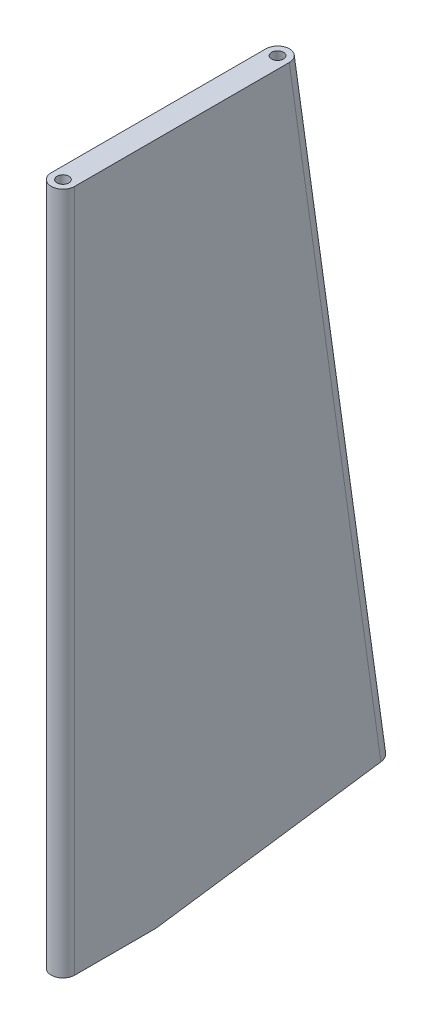
ISO-10303-21;
HEADER;
FILE_DESCRIPTION(('STEP AP214'),'2;1');
FILE_NAME('part.step','',(''),(''),'','','');
FILE_SCHEMA(('AUTOMOTIVE_DESIGN { 1 0 10303 214 1 1 1 1 }'));
ENDSEC;
DATA;
#1=APPLICATION_CONTEXT('core data for automotive mechanical design processes');
#2=APPLICATION_PROTOCOL_DEFINITION('international standard','automotive_design',2000,#1);
#3=PRODUCT_CONTEXT('',#1,'mechanical');
#4=PRODUCT('Part','Part','',(#3));
#5=PRODUCT_RELATED_PRODUCT_CATEGORY('part','',(#4));
#6=PRODUCT_DEFINITION_FORMATION('','',#4);
#7=PRODUCT_DEFINITION_CONTEXT('part definition',#1,'design');
#8=PRODUCT_DEFINITION('design','',#6,#7);
#9=PRODUCT_DEFINITION_SHAPE('','',#8);
#10=(LENGTH_UNIT() NAMED_UNIT(*) SI_UNIT(.MILLI.,.METRE.));
#11=(NAMED_UNIT(*) PLANE_ANGLE_UNIT() SI_UNIT($,.RADIAN.));
#12=(NAMED_UNIT(*) SI_UNIT($,.STERADIAN.) SOLID_ANGLE_UNIT());
#13=UNCERTAINTY_MEASURE_WITH_UNIT(LENGTH_MEASURE(1.E-05),#10,'distance_accuracy_value','');
#14=(GEOMETRIC_REPRESENTATION_CONTEXT(3) GLOBAL_UNCERTAINTY_ASSIGNED_CONTEXT((#13)) GLOBAL_UNIT_ASSIGNED_CONTEXT((#10,
#11,#12)) REPRESENTATION_CONTEXT('',''));
#15=CARTESIAN_POINT('',(0.,0.,0.));
#16=DIRECTION('',(0.,0.,1.));
#17=DIRECTION('',(1.,0.,0.));
#18=AXIS2_PLACEMENT_3D('',#15,#16,#17);
#19=CARTESIAN_POINT('',(2.,58.,0.));
#20=DIRECTION('',(0.,1.,0.));
#21=DIRECTION('',(0.,0.,1.));
#22=AXIS2_PLACEMENT_3D('',#19,#20,#21);
#23=PLANE('',#22);
#24=DIRECTION('',(0.,0.,-1.));
#25=VECTOR('',#24,1.);
#26=CARTESIAN_POINT('',(0.,58.,0.));
#27=LINE('',#26,#25);
#28=CARTESIAN_POINT('',(0.,58.,1.));
#29=VERTEX_POINT('',#28);
#30=CARTESIAN_POINT('',(0.,58.,-17.2161339187549));
#31=VERTEX_POINT('',#30);
#32=EDGE_CURVE('E124',#29,#31,#27,.T.);
#33=ORIENTED_EDGE('',*,*,#32,.F.);
#34=CARTESIAN_POINT('',(1.,58.,1.));
#35=DIRECTION('',(0.,1.,0.));
#36=DIRECTION('',(0.,0.,1.));
#37=AXIS2_PLACEMENT_3D('',#34,#35,#36);
#38=CIRCLE('',#37,1.);
#39=CARTESIAN_POINT('',(2.,58.,1.));
#40=VERTEX_POINT('',#39);
#41=EDGE_CURVE('E110',#29,#40,#38,.T.);
#42=ORIENTED_EDGE('',*,*,#41,.T.);
#43=DIRECTION('',(0.,0.,-1.));
#44=VECTOR('',#43,1.);
#45=CARTESIAN_POINT('',(2.,58.,0.));
#46=LINE('',#45,#44);
#47=CARTESIAN_POINT('',(2.,58.,-17.2161339187549));
#48=VERTEX_POINT('',#47);
#49=EDGE_CURVE('E83',#40,#48,#46,.T.);
#50=ORIENTED_EDGE('',*,*,#49,.T.);
#51=CARTESIAN_POINT('',(1.,58.,-17.2161339187549));
#52=DIRECTION('',(0.,1.,0.));
#53=DIRECTION('',(0.,0.,-1.));
#54=AXIS2_PLACEMENT_3D('',#51,#52,#53);
#55=ELLIPSE('',#54,1.00982757251862,1.);
#56=EDGE_CURVE('E91',#31,#48,#55,.F.);
#57=ORIENTED_EDGE('',*,*,#56,.F.);
#58=EDGE_LOOP('',(#33,#42,#50,#57));
#59=FACE_BOUND('',#58,.T.);
#60=CARTESIAN_POINT('',(1.,58.,1.));
#61=DIRECTION('',(0.,1.,0.));
#62=DIRECTION('',(0.,0.,1.));
#63=AXIS2_PLACEMENT_3D('',#60,#61,#62);
#64=CIRCLE('',#63,0.5);
#65=CARTESIAN_POINT('',(1.,58.,1.5));
#66=VERTEX_POINT('',#65);
#67=EDGE_CURVE('E103',#66,#66,#64,.T.);
#68=ORIENTED_EDGE('',*,*,#67,.F.);
#69=EDGE_LOOP('',(#68));
#70=FACE_BOUND('',#69,.T.);
#71=CARTESIAN_POINT('',(1.,58.,-17.2161339187549));
#72=DIRECTION('',(0.,1.,0.));
#73=DIRECTION('',(0.,0.,-1.));
#74=AXIS2_PLACEMENT_3D('',#71,#72,#73);
#75=ELLIPSE('',#74,0.50491378625931,0.500000000000001);
#76=CARTESIAN_POINT('',(1.,58.,-17.7210477050142));
#77=VERTEX_POINT('',#76);
#78=EDGE_CURVE('E99',#77,#77,#75,.F.);
#79=ORIENTED_EDGE('',*,*,#78,.T.);
#80=EDGE_LOOP('',(#79));
#81=FACE_BOUND('',#80,.T.);
#82=ADVANCED_FACE('F35',(#59,#70,#81),#23,.T.);
#83=CARTESIAN_POINT('',(2.,0.,-5.8914683703043));
#84=DIRECTION('',(0.,-1.,0.));
#85=DIRECTION('',(0.,0.,-1.));
#86=AXIS2_PLACEMENT_3D('',#83,#84,#85);
#87=PLANE('',#86);
#88=DIRECTION('',(0.,0.,1.));
#89=VECTOR('',#88,1.);
#90=CARTESIAN_POINT('',(0.,0.,-5.8914683703043));
#91=LINE('',#90,#89);
#92=CARTESIAN_POINT('',(0.,0.,-5.8914683703043));
#93=VERTEX_POINT('',#92);
#94=CARTESIAN_POINT('',(0.,0.,1.));
#95=VERTEX_POINT('',#94);
#96=EDGE_CURVE('E127',#93,#95,#91,.T.);
#97=ORIENTED_EDGE('',*,*,#96,.F.);
#98=DIRECTION('',(-1.,0.,0.));
#99=VECTOR('',#98,1.);
#100=CARTESIAN_POINT('',(2.,0.,-5.8914683703043));
#101=LINE('',#100,#99);
#102=CARTESIAN_POINT('',(2.,0.,-5.8914683703043));
#103=VERTEX_POINT('',#102);
#104=EDGE_CURVE('E11',#103,#93,#101,.T.);
#105=ORIENTED_EDGE('',*,*,#104,.F.);
#106=DIRECTION('',(0.,0.,1.));
#107=VECTOR('',#106,1.);
#108=CARTESIAN_POINT('',(2.,0.,-5.8914683703043));
#109=LINE('',#108,#107);
#110=CARTESIAN_POINT('',(2.,0.,1.));
#111=VERTEX_POINT('',#110);
#112=EDGE_CURVE('E43',#103,#111,#109,.T.);
#113=ORIENTED_EDGE('',*,*,#112,.T.);
#114=CARTESIAN_POINT('',(1.,0.,1.));
#115=DIRECTION('',(0.,1.,0.));
#116=DIRECTION('',(0.,0.,-1.));
#117=AXIS2_PLACEMENT_3D('',#114,#115,#116);
#118=CIRCLE('',#117,1.);
#119=EDGE_CURVE('E116',#95,#111,#118,.T.);
#120=ORIENTED_EDGE('',*,*,#119,.F.);
#121=EDGE_LOOP('',(#97,#105,#113,#120));
#122=FACE_BOUND('',#121,.T.);
#123=CARTESIAN_POINT('',(1.,0.,1.));
#124=DIRECTION('',(0.,1.,0.));
#125=DIRECTION('',(0.,0.,1.));
#126=AXIS2_PLACEMENT_3D('',#123,#124,#125);
#127=CIRCLE('',#126,0.5);
#128=CARTESIAN_POINT('',(1.,0.,1.5));
#129=VERTEX_POINT('',#128);
#130=EDGE_CURVE('E113',#129,#129,#127,.T.);
#131=ORIENTED_EDGE('',*,*,#130,.T.);
#132=EDGE_LOOP('',(#131));
#133=FACE_BOUND('',#132,.T.);
#134=ADVANCED_FACE('F139',(#122,#133),#87,.T.);
#135=CARTESIAN_POINT('',(2.,2.5449881504721,-24.));
#136=DIRECTION('',(0.,-0.99026806874157,-0.139173100960066));
#137=DIRECTION('',(0.,0.139173100960066,-0.99026806874157));
#138=AXIS2_PLACEMENT_3D('',#135,#136,#137);
#139=PLANE('',#138);
#140=DIRECTION('',(0.,-0.139173100960066,0.99026806874157));
#141=VECTOR('',#140,1.);
#142=CARTESIAN_POINT('',(0.,2.5449881504721,-24.));
#143=LINE('',#142,#141);
#144=CARTESIAN_POINT('',(0.,2.68416125143216,-24.9902680687416));
#145=VERTEX_POINT('',#144);
#146=EDGE_CURVE('E97',#145,#93,#143,.T.);
#147=ORIENTED_EDGE('',*,*,#146,.F.);
#148=CARTESIAN_POINT('',(1.,2.68416125143216,-24.9902680687416));
#149=DIRECTION('',(0.,-0.99026806874157,-0.139173100960066));
#150=DIRECTION('',(0.,-0.139173100960066,0.99026806874157));
#151=AXIS2_PLACEMENT_3D('',#148,#149,#150);
#152=CIRCLE('',#151,1.);
#153=CARTESIAN_POINT('',(2.,2.68416125143216,-24.9902680687416));
#154=VERTEX_POINT('',#153);
#155=EDGE_CURVE('E89',#145,#154,#152,.T.);
#156=ORIENTED_EDGE('',*,*,#155,.T.);
#157=DIRECTION('',(0.,-0.139173100960066,0.99026806874157));
#158=VECTOR('',#157,1.);
#159=CARTESIAN_POINT('',(2.,2.5449881504721,-24.));
#160=LINE('',#159,#158);
#161=EDGE_CURVE('E75',#154,#103,#160,.T.);
#162=ORIENTED_EDGE('',*,*,#161,.T.);
#163=ORIENTED_EDGE('',*,*,#104,.T.);
#164=EDGE_LOOP('',(#147,#156,#162,#163));
#165=FACE_BOUND('',#164,.T.);
#166=CARTESIAN_POINT('',(1.,2.68416125143216,-24.9902680687416));
#167=DIRECTION('',(0.,-0.99026806874157,-0.139173100960066));
#168=DIRECTION('',(0.,0.139173100960066,-0.99026806874157));
#169=AXIS2_PLACEMENT_3D('',#166,#167,#168);
#170=CIRCLE('',#169,0.500000000000001);
#171=CARTESIAN_POINT('',(1.,2.7537478019122,-25.4854021031123));
#172=VERTEX_POINT('',#171);
#173=EDGE_CURVE('E100',#172,#172,#170,.T.);
#174=ORIENTED_EDGE('',*,*,#173,.F.);
#175=EDGE_LOOP('',(#174));
#176=FACE_BOUND('',#175,.T.);
#177=ADVANCED_FACE('F94',(#165,#176),#139,.T.);
#178=CARTESIAN_POINT('',(2.,0.,0.));
#179=DIRECTION('',(1.,0.,0.));
#180=DIRECTION('',(0.,0.,-1.));
#181=AXIS2_PLACEMENT_3D('',#178,#179,#180);
#182=PLANE('',#181);
#183=ORIENTED_EDGE('',*,*,#49,.F.);
#184=DIRECTION('',(0.,-1.,0.));
#185=VECTOR('',#184,1.);
#186=CARTESIAN_POINT('',(2.,60.8284271247462,1.));
#187=LINE('',#186,#185);
#188=EDGE_CURVE('E119',#40,#111,#187,.T.);
#189=ORIENTED_EDGE('',*,*,#188,.T.);
#190=ORIENTED_EDGE('',*,*,#112,.F.);
#191=ORIENTED_EDGE('',*,*,#161,.F.);
#192=DIRECTION('',(0.,-0.99026806874157,-0.139173100960066));
#193=VECTOR('',#192,1.);
#194=CARTESIAN_POINT('',(2.,60.8146640955725,-16.8205586773563));
#195=LINE('',#194,#193);
#196=EDGE_CURVE('E78',#48,#154,#195,.T.);
#197=ORIENTED_EDGE('',*,*,#196,.F.);
#198=EDGE_LOOP('',(#183,#189,#190,#191,#197));
#199=FACE_BOUND('',#198,.T.);
#200=ADVANCED_FACE('F77',(#199),#182,.T.);
#201=CARTESIAN_POINT('',(0.,0.,0.));
#202=DIRECTION('',(1.,0.,0.));
#203=DIRECTION('',(0.,0.,-1.));
#204=AXIS2_PLACEMENT_3D('',#201,#202,#203);
#205=PLANE('',#204);
#206=ORIENTED_EDGE('',*,*,#32,.T.);
#207=DIRECTION('',(0.,-0.99026806874157,-0.139173100960066));
#208=VECTOR('',#207,1.);
#209=CARTESIAN_POINT('',(0.,60.8146640955725,-16.8205586773563));
#210=LINE('',#209,#208);
#211=EDGE_CURVE('E92',#31,#145,#210,.T.);
#212=ORIENTED_EDGE('',*,*,#211,.T.);
#213=ORIENTED_EDGE('',*,*,#146,.T.);
#214=ORIENTED_EDGE('',*,*,#96,.T.);
#215=DIRECTION('',(0.,-1.,0.));
#216=VECTOR('',#215,1.);
#217=CARTESIAN_POINT('',(0.,60.8284271247462,1.));
#218=LINE('',#217,#216);
#219=EDGE_CURVE('E121',#29,#95,#218,.T.);
#220=ORIENTED_EDGE('',*,*,#219,.F.);
#221=EDGE_LOOP('',(#206,#212,#213,#214,#220));
#222=FACE_BOUND('',#221,.T.);
#223=ADVANCED_FACE('F133',(#222),#205,.F.);
#224=CARTESIAN_POINT('',(1.,60.8284271247462,1.));
#225=DIRECTION('',(0.,-1.,0.));
#226=DIRECTION('',(0.,0.,-1.));
#227=AXIS2_PLACEMENT_3D('',#224,#225,#226);
#228=CYLINDRICAL_SURFACE('',#227,1.);
#229=ORIENTED_EDGE('',*,*,#41,.F.);
#230=ORIENTED_EDGE('',*,*,#219,.T.);
#231=ORIENTED_EDGE('',*,*,#119,.T.);
#232=ORIENTED_EDGE('',*,*,#188,.F.);
#233=EDGE_LOOP('',(#229,#230,#231,#232));
#234=FACE_BOUND('',#233,.T.);
#235=ADVANCED_FACE('F137',(#234),#228,.T.);
#236=CARTESIAN_POINT('',(1.,60.8284271247462,1.));
#237=DIRECTION('',(0.,-1.,0.));
#238=DIRECTION('',(0.,0.,-1.));
#239=AXIS2_PLACEMENT_3D('',#236,#237,#238);
#240=CYLINDRICAL_SURFACE('',#239,0.5);
#241=ORIENTED_EDGE('',*,*,#130,.F.);
#242=EDGE_LOOP('',(#241));
#243=FACE_BOUND('',#242,.T.);
#244=ORIENTED_EDGE('',*,*,#67,.T.);
#245=EDGE_LOOP('',(#244));
#246=FACE_BOUND('',#245,.T.);
#247=ADVANCED_FACE('F155',(#243,#246),#240,.F.);
#248=CARTESIAN_POINT('',(1.,60.8146640955725,-16.8205586773563));
#249=DIRECTION('',(0.,-0.99026806874157,-0.139173100960066));
#250=DIRECTION('',(0.,0.139173100960066,-0.99026806874157));
#251=AXIS2_PLACEMENT_3D('',#248,#249,#250);
#252=CYLINDRICAL_SURFACE('',#251,1.);
#253=ORIENTED_EDGE('',*,*,#211,.F.);
#254=ORIENTED_EDGE('',*,*,#56,.T.);
#255=ORIENTED_EDGE('',*,*,#196,.T.);
#256=ORIENTED_EDGE('',*,*,#155,.F.);
#257=EDGE_LOOP('',(#253,#254,#255,#256));
#258=FACE_BOUND('',#257,.T.);
#259=ADVANCED_FACE('F88',(#258),#252,.T.);
#260=CARTESIAN_POINT('',(1.,60.8146640955725,-16.8205586773563));
#261=DIRECTION('',(0.,-0.99026806874157,-0.139173100960066));
#262=DIRECTION('',(0.,0.139173100960066,-0.99026806874157));
#263=AXIS2_PLACEMENT_3D('',#260,#261,#262);
#264=CYLINDRICAL_SURFACE('',#263,0.500000000000001);
#265=ORIENTED_EDGE('',*,*,#173,.T.);
#266=EDGE_LOOP('',(#265));
#267=FACE_BOUND('',#266,.T.);
#268=ORIENTED_EDGE('',*,*,#78,.F.);
#269=EDGE_LOOP('',(#268));
#270=FACE_BOUND('',#269,.T.);
#271=ADVANCED_FACE('F148',(#267,#270),#264,.F.);
#272=CLOSED_SHELL('',(#82,#134,#177,#200,#223,#235,#247,#259,#271));
#273=MANIFOLD_SOLID_BREP('B2',#272);
#274=ADVANCED_BREP_SHAPE_REPRESENTATION('',(#18,#273),#14);
#275=SHAPE_DEFINITION_REPRESENTATION(#9,#274);
ENDSEC;
END-ISO-10303-21;
